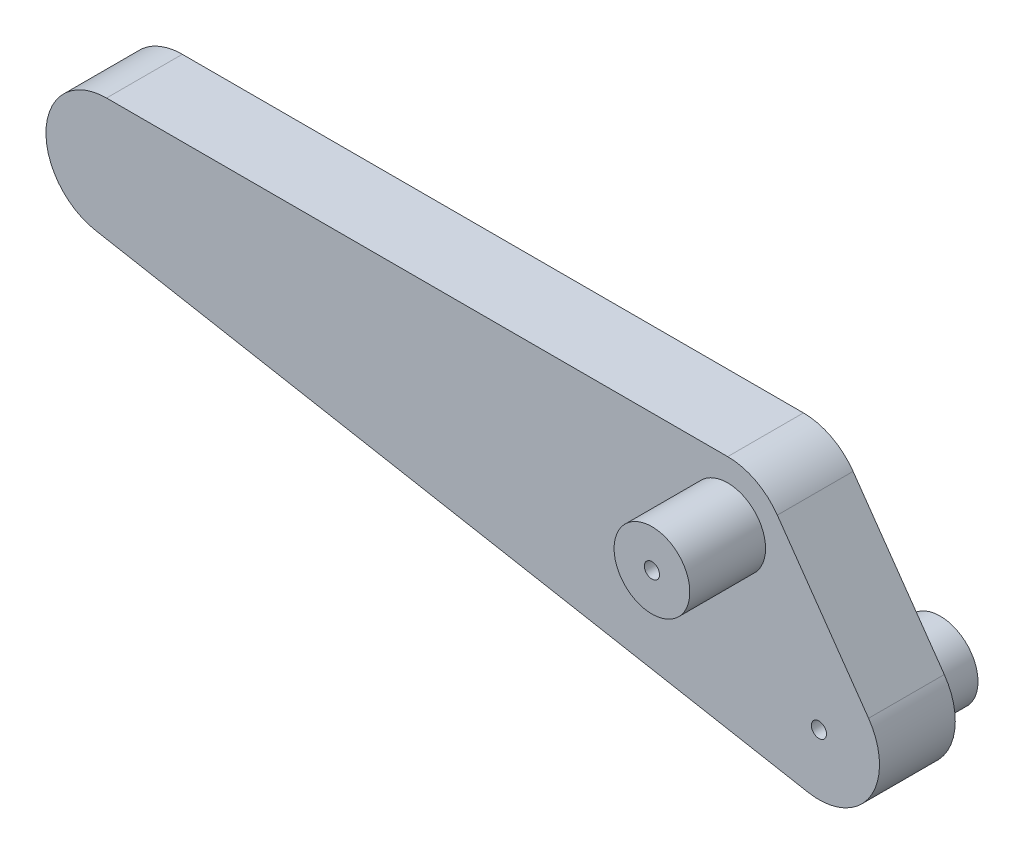
ISO-10303-21;
HEADER;
FILE_DESCRIPTION(('STEP AP214'),'2;1');
FILE_NAME('part.step','',(''),(''),'','','');
FILE_SCHEMA(('AUTOMOTIVE_DESIGN { 1 0 10303 214 1 1 1 1 }'));
ENDSEC;
DATA;
#1=APPLICATION_CONTEXT('core data for automotive mechanical design processes');
#2=APPLICATION_PROTOCOL_DEFINITION('international standard','automotive_design',2000,#1);
#3=PRODUCT_CONTEXT('',#1,'mechanical');
#4=PRODUCT('Part','Part','',(#3));
#5=PRODUCT_RELATED_PRODUCT_CATEGORY('part','',(#4));
#6=PRODUCT_DEFINITION_FORMATION('','',#4);
#7=PRODUCT_DEFINITION_CONTEXT('part definition',#1,'design');
#8=PRODUCT_DEFINITION('design','',#6,#7);
#9=PRODUCT_DEFINITION_SHAPE('','',#8);
#10=(LENGTH_UNIT() NAMED_UNIT(*) SI_UNIT(.MILLI.,.METRE.));
#11=(NAMED_UNIT(*) PLANE_ANGLE_UNIT() SI_UNIT($,.RADIAN.));
#12=(NAMED_UNIT(*) SI_UNIT($,.STERADIAN.) SOLID_ANGLE_UNIT());
#13=UNCERTAINTY_MEASURE_WITH_UNIT(LENGTH_MEASURE(1.E-05),#10,'distance_accuracy_value','');
#14=(GEOMETRIC_REPRESENTATION_CONTEXT(3) GLOBAL_UNCERTAINTY_ASSIGNED_CONTEXT((#13)) GLOBAL_UNIT_ASSIGNED_CONTEXT((#10,
#11,#12)) REPRESENTATION_CONTEXT('',''));
#15=CARTESIAN_POINT('',(0.,0.,0.));
#16=DIRECTION('',(0.,0.,1.));
#17=DIRECTION('',(1.,0.,0.));
#18=AXIS2_PLACEMENT_3D('',#15,#16,#17);
#19=CARTESIAN_POINT('',(0.,0.,5.));
#20=DIRECTION('',(0.,0.,1.));
#21=DIRECTION('',(1.,0.,0.));
#22=AXIS2_PLACEMENT_3D('',#19,#20,#21);
#23=PLANE('',#22);
#24=CARTESIAN_POINT('',(0.,0.,5.));
#25=DIRECTION('',(0.,0.,1.));
#26=DIRECTION('',(1.,0.,0.));
#27=AXIS2_PLACEMENT_3D('',#24,#25,#26);
#28=CIRCLE('',#27,2.5);
#29=CARTESIAN_POINT('',(2.5,0.,5.));
#30=VERTEX_POINT('',#29);
#31=EDGE_CURVE('E123',#30,#30,#28,.T.);
#32=ORIENTED_EDGE('',*,*,#31,.F.);
#33=EDGE_LOOP('',(#32));
#34=FACE_BOUND('',#33,.T.);
#35=CARTESIAN_POINT('',(0.,0.,5.));
#36=DIRECTION('',(0.,0.,1.));
#37=DIRECTION('',(1.,0.,0.));
#38=AXIS2_PLACEMENT_3D('',#35,#36,#37);
#39=CIRCLE('',#38,4.);
#40=CARTESIAN_POINT('',(3.27660817715596,2.2943057454042,5.));
#41=VERTEX_POINT('',#40);
#42=CARTESIAN_POINT('',(0.,4.,5.));
#43=VERTEX_POINT('',#42);
#44=EDGE_CURVE('E130',#41,#43,#39,.T.);
#45=ORIENTED_EDGE('',*,*,#44,.T.);
#46=DIRECTION('',(-1.,0.,0.));
#47=VECTOR('',#46,1.);
#48=CARTESIAN_POINT('',(-41.,3.99999999999999,5.));
#49=LINE('',#48,#47);
#50=CARTESIAN_POINT('',(-41.,3.99999999999999,5.));
#51=VERTEX_POINT('',#50);
#52=EDGE_CURVE('E88',#43,#51,#49,.T.);
#53=ORIENTED_EDGE('',*,*,#52,.T.);
#54=CARTESIAN_POINT('',(-41.,0.,5.));
#55=DIRECTION('',(0.,0.,1.));
#56=DIRECTION('',(1.,0.,0.));
#57=AXIS2_PLACEMENT_3D('',#54,#55,#56);
#58=CIRCLE('',#57,4.);
#59=CARTESIAN_POINT('',(-41.7197161864064,-3.9347183648928,5.));
#60=VERTEX_POINT('',#59);
#61=EDGE_CURVE('E101',#51,#60,#58,.T.);
#62=ORIENTED_EDGE('',*,*,#61,.T.);
#63=DIRECTION('',(0.983679591223199,-0.179929046601599,0.));
#64=VECTOR('',#63,1.);
#65=CARTESIAN_POINT('',(5.30283639527963,-12.5358148299272,5.));
#66=LINE('',#65,#64);
#67=CARTESIAN_POINT('',(5.30283639527963,-12.5358148299272,5.));
#68=VERTEX_POINT('',#67);
#69=EDGE_CURVE('E95',#60,#68,#66,.T.);
#70=ORIENTED_EDGE('',*,*,#69,.T.);
#71=CARTESIAN_POINT('',(6.02255258168603,-8.60109646503438,5.));
#72=DIRECTION('',(0.,0.,1.));
#73=DIRECTION('',(1.,0.,0.));
#74=AXIS2_PLACEMENT_3D('',#71,#72,#73);
#75=CIRCLE('',#74,4.);
#76=CARTESIAN_POINT('',(9.29916075884199,-6.30679071963019,5.));
#77=VERTEX_POINT('',#76);
#78=EDGE_CURVE('E99',#68,#77,#75,.T.);
#79=ORIENTED_EDGE('',*,*,#78,.T.);
#80=DIRECTION('',(-0.57357643635105,0.819152044288989,0.));
#81=VECTOR('',#80,1.);
#82=CARTESIAN_POINT('',(3.27660817715596,2.2943057454042,5.));
#83=LINE('',#82,#81);
#84=EDGE_CURVE('E51',#77,#41,#83,.T.);
#85=ORIENTED_EDGE('',*,*,#84,.T.);
#86=EDGE_LOOP('',(#45,#53,#62,#70,#79,#85));
#87=FACE_BOUND('',#86,.T.);
#88=CARTESIAN_POINT('',(6.02255258168603,-8.60109646503438,5.));
#89=DIRECTION('',(0.,0.,1.));
#90=DIRECTION('',(1.,0.,0.));
#91=AXIS2_PLACEMENT_3D('',#88,#89,#90);
#92=CIRCLE('',#91,0.500000000000001);
#93=CARTESIAN_POINT('',(6.52255258168603,-8.60109646503438,5.));
#94=VERTEX_POINT('',#93);
#95=EDGE_CURVE('E199',#94,#94,#92,.T.);
#96=ORIENTED_EDGE('',*,*,#95,.F.);
#97=EDGE_LOOP('',(#96));
#98=FACE_BOUND('',#97,.T.);
#99=ADVANCED_FACE('F34',(#34,#87,#98),#23,.T.);
#100=CARTESIAN_POINT('',(0.,0.,0.));
#101=DIRECTION('',(0.,0.,1.));
#102=DIRECTION('',(1.,0.,0.));
#103=AXIS2_PLACEMENT_3D('',#100,#101,#102);
#104=PLANE('',#103);
#105=CARTESIAN_POINT('',(0.,0.,0.));
#106=DIRECTION('',(0.,0.,1.));
#107=DIRECTION('',(1.,0.,0.));
#108=AXIS2_PLACEMENT_3D('',#105,#106,#107);
#109=CIRCLE('',#108,4.);
#110=CARTESIAN_POINT('',(3.27660817715596,2.2943057454042,0.));
#111=VERTEX_POINT('',#110);
#112=CARTESIAN_POINT('',(0.,4.,0.));
#113=VERTEX_POINT('',#112);
#114=EDGE_CURVE('E119',#111,#113,#109,.T.);
#115=ORIENTED_EDGE('',*,*,#114,.F.);
#116=DIRECTION('',(-0.57357643635105,0.819152044288989,0.));
#117=VECTOR('',#116,1.);
#118=CARTESIAN_POINT('',(3.27660817715596,2.2943057454042,0.));
#119=LINE('',#118,#117);
#120=CARTESIAN_POINT('',(9.29916075884199,-6.30679071963019,0.));
#121=VERTEX_POINT('',#120);
#122=EDGE_CURVE('E80',#121,#111,#119,.T.);
#123=ORIENTED_EDGE('',*,*,#122,.F.);
#124=CARTESIAN_POINT('',(6.02255258168603,-8.60109646503438,0.));
#125=DIRECTION('',(0.,0.,1.));
#126=DIRECTION('',(1.,0.,0.));
#127=AXIS2_PLACEMENT_3D('',#124,#125,#126);
#128=CIRCLE('',#127,4.);
#129=CARTESIAN_POINT('',(5.30283639527963,-12.5358148299272,0.));
#130=VERTEX_POINT('',#129);
#131=EDGE_CURVE('E74',#130,#121,#128,.T.);
#132=ORIENTED_EDGE('',*,*,#131,.F.);
#133=DIRECTION('',(0.983679591223199,-0.179929046601599,0.));
#134=VECTOR('',#133,1.);
#135=CARTESIAN_POINT('',(5.30283639527963,-12.5358148299272,0.));
#136=LINE('',#135,#134);
#137=CARTESIAN_POINT('',(-41.7197161864064,-3.9347183648928,0.));
#138=VERTEX_POINT('',#137);
#139=EDGE_CURVE('E109',#138,#130,#136,.T.);
#140=ORIENTED_EDGE('',*,*,#139,.F.);
#141=CARTESIAN_POINT('',(-41.,0.,0.));
#142=DIRECTION('',(0.,0.,1.));
#143=DIRECTION('',(1.,0.,0.));
#144=AXIS2_PLACEMENT_3D('',#141,#142,#143);
#145=CIRCLE('',#144,4.);
#146=CARTESIAN_POINT('',(-41.,3.99999999999999,0.));
#147=VERTEX_POINT('',#146);
#148=EDGE_CURVE('E125',#147,#138,#145,.T.);
#149=ORIENTED_EDGE('',*,*,#148,.F.);
#150=DIRECTION('',(-1.,0.,0.));
#151=VECTOR('',#150,1.);
#152=CARTESIAN_POINT('',(-41.,3.99999999999999,0.));
#153=LINE('',#152,#151);
#154=EDGE_CURVE('E122',#113,#147,#153,.T.);
#155=ORIENTED_EDGE('',*,*,#154,.F.);
#156=EDGE_LOOP('',(#115,#123,#132,#140,#149,#155));
#157=FACE_BOUND('',#156,.T.);
#158=CARTESIAN_POINT('',(6.02255258168603,-8.60109646503438,0.));
#159=DIRECTION('',(0.,0.,1.));
#160=DIRECTION('',(1.,0.,0.));
#161=AXIS2_PLACEMENT_3D('',#158,#159,#160);
#162=CIRCLE('',#161,2.5);
#163=CARTESIAN_POINT('',(8.52255258168603,-8.60109646503438,0.));
#164=VERTEX_POINT('',#163);
#165=EDGE_CURVE('E208',#164,#164,#162,.T.);
#166=ORIENTED_EDGE('',*,*,#165,.T.);
#167=EDGE_LOOP('',(#166));
#168=FACE_BOUND('',#167,.T.);
#169=CARTESIAN_POINT('',(0.,0.,0.));
#170=DIRECTION('',(0.,0.,-1.));
#171=DIRECTION('',(-1.,0.,0.));
#172=AXIS2_PLACEMENT_3D('',#169,#170,#171);
#173=CIRCLE('',#172,0.5);
#174=CARTESIAN_POINT('',(-0.5,0.,0.));
#175=VERTEX_POINT('',#174);
#176=EDGE_CURVE('E191',#175,#175,#173,.T.);
#177=ORIENTED_EDGE('',*,*,#176,.F.);
#178=EDGE_LOOP('',(#177));
#179=FACE_BOUND('',#178,.T.);
#180=ADVANCED_FACE('F139',(#157,#168,#179),#104,.F.);
#181=CARTESIAN_POINT('',(0.,0.,5.));
#182=DIRECTION('',(0.,0.,-1.));
#183=DIRECTION('',(-1.,0.,0.));
#184=AXIS2_PLACEMENT_3D('',#181,#182,#183);
#185=CYLINDRICAL_SURFACE('',#184,4.);
#186=ORIENTED_EDGE('',*,*,#114,.T.);
#187=DIRECTION('',(0.,0.,-1.));
#188=VECTOR('',#187,1.);
#189=CARTESIAN_POINT('',(0.,4.,5.));
#190=LINE('',#189,#188);
#191=EDGE_CURVE('E11',#43,#113,#190,.T.);
#192=ORIENTED_EDGE('',*,*,#191,.F.);
#193=ORIENTED_EDGE('',*,*,#44,.F.);
#194=DIRECTION('',(0.,0.,-1.));
#195=VECTOR('',#194,1.);
#196=CARTESIAN_POINT('',(3.27660817715596,2.2943057454042,5.));
#197=LINE('',#196,#195);
#198=EDGE_CURVE('E115',#41,#111,#197,.T.);
#199=ORIENTED_EDGE('',*,*,#198,.T.);
#200=EDGE_LOOP('',(#186,#192,#193,#199));
#201=FACE_BOUND('',#200,.T.);
#202=ADVANCED_FACE('F36',(#201),#185,.T.);
#203=CARTESIAN_POINT('',(-41.,3.99999999999999,5.));
#204=DIRECTION('',(0.,-1.,0.));
#205=DIRECTION('',(1.,0.,0.));
#206=AXIS2_PLACEMENT_3D('',#203,#204,#205);
#207=PLANE('',#206);
#208=ORIENTED_EDGE('',*,*,#154,.T.);
#209=DIRECTION('',(0.,0.,-1.));
#210=VECTOR('',#209,1.);
#211=CARTESIAN_POINT('',(-41.,3.99999999999999,5.));
#212=LINE('',#211,#210);
#213=EDGE_CURVE('E43',#51,#147,#212,.T.);
#214=ORIENTED_EDGE('',*,*,#213,.F.);
#215=ORIENTED_EDGE('',*,*,#52,.F.);
#216=ORIENTED_EDGE('',*,*,#191,.T.);
#217=EDGE_LOOP('',(#208,#214,#215,#216));
#218=FACE_BOUND('',#217,.T.);
#219=ADVANCED_FACE('F277',(#218),#207,.F.);
#220=CARTESIAN_POINT('',(-41.,0.,5.));
#221=DIRECTION('',(0.,0.,-1.));
#222=DIRECTION('',(-1.,0.,0.));
#223=AXIS2_PLACEMENT_3D('',#220,#221,#222);
#224=CYLINDRICAL_SURFACE('',#223,4.);
#225=ORIENTED_EDGE('',*,*,#148,.T.);
#226=DIRECTION('',(0.,0.,-1.));
#227=VECTOR('',#226,1.);
#228=CARTESIAN_POINT('',(-41.7197161864064,-3.9347183648928,5.));
#229=LINE('',#228,#227);
#230=EDGE_CURVE('E110',#60,#138,#229,.T.);
#231=ORIENTED_EDGE('',*,*,#230,.F.);
#232=ORIENTED_EDGE('',*,*,#61,.F.);
#233=ORIENTED_EDGE('',*,*,#213,.T.);
#234=EDGE_LOOP('',(#225,#231,#232,#233));
#235=FACE_BOUND('',#234,.T.);
#236=ADVANCED_FACE('F136',(#235),#224,.T.);
#237=CARTESIAN_POINT('',(5.30283639527963,-12.5358148299272,5.));
#238=DIRECTION('',(0.179929046601599,0.983679591223199,0.));
#239=DIRECTION('',(-0.983679591223199,0.179929046601599,0.));
#240=AXIS2_PLACEMENT_3D('',#237,#238,#239);
#241=PLANE('',#240);
#242=ORIENTED_EDGE('',*,*,#139,.T.);
#243=DIRECTION('',(0.,0.,-1.));
#244=VECTOR('',#243,1.);
#245=CARTESIAN_POINT('',(5.30283639527963,-12.5358148299272,5.));
#246=LINE('',#245,#244);
#247=EDGE_CURVE('E106',#68,#130,#246,.T.);
#248=ORIENTED_EDGE('',*,*,#247,.F.);
#249=ORIENTED_EDGE('',*,*,#69,.F.);
#250=ORIENTED_EDGE('',*,*,#230,.T.);
#251=EDGE_LOOP('',(#242,#248,#249,#250));
#252=FACE_BOUND('',#251,.T.);
#253=ADVANCED_FACE('F107',(#252),#241,.F.);
#254=CARTESIAN_POINT('',(6.02255258168603,-8.60109646503438,5.));
#255=DIRECTION('',(0.,0.,-1.));
#256=DIRECTION('',(-1.,0.,0.));
#257=AXIS2_PLACEMENT_3D('',#254,#255,#256);
#258=CYLINDRICAL_SURFACE('',#257,4.);
#259=ORIENTED_EDGE('',*,*,#131,.T.);
#260=DIRECTION('',(0.,0.,-1.));
#261=VECTOR('',#260,1.);
#262=CARTESIAN_POINT('',(9.29916075884199,-6.30679071963019,5.));
#263=LINE('',#262,#261);
#264=EDGE_CURVE('E111',#77,#121,#263,.T.);
#265=ORIENTED_EDGE('',*,*,#264,.F.);
#266=ORIENTED_EDGE('',*,*,#78,.F.);
#267=ORIENTED_EDGE('',*,*,#247,.T.);
#268=EDGE_LOOP('',(#259,#265,#266,#267));
#269=FACE_BOUND('',#268,.T.);
#270=ADVANCED_FACE('F113',(#269),#258,.T.);
#271=CARTESIAN_POINT('',(3.27660817715596,2.2943057454042,5.));
#272=DIRECTION('',(-0.819152044288989,-0.57357643635105,0.));
#273=DIRECTION('',(0.57357643635105,-0.819152044288989,0.));
#274=AXIS2_PLACEMENT_3D('',#271,#272,#273);
#275=PLANE('',#274);
#276=ORIENTED_EDGE('',*,*,#122,.T.);
#277=ORIENTED_EDGE('',*,*,#198,.F.);
#278=ORIENTED_EDGE('',*,*,#84,.F.);
#279=ORIENTED_EDGE('',*,*,#264,.T.);
#280=EDGE_LOOP('',(#276,#277,#278,#279));
#281=FACE_BOUND('',#280,.T.);
#282=ADVANCED_FACE('F144',(#281),#275,.F.);
#283=CARTESIAN_POINT('',(6.02255258168603,-8.60109646503438,-3.));
#284=DIRECTION('',(0.,0.,1.));
#285=DIRECTION('',(1.,0.,0.));
#286=AXIS2_PLACEMENT_3D('',#283,#284,#285);
#287=CYLINDRICAL_SURFACE('',#286,2.5);
#288=CARTESIAN_POINT('',(6.02255258168603,-8.60109646503438,-3.));
#289=DIRECTION('',(0.,0.,1.));
#290=DIRECTION('',(1.,0.,0.));
#291=AXIS2_PLACEMENT_3D('',#288,#289,#290);
#292=CIRCLE('',#291,2.5);
#293=CARTESIAN_POINT('',(8.52255258168603,-8.60109646503438,-3.));
#294=VERTEX_POINT('',#293);
#295=EDGE_CURVE('E203',#294,#294,#292,.T.);
#296=ORIENTED_EDGE('',*,*,#295,.T.);
#297=EDGE_LOOP('',(#296));
#298=FACE_BOUND('',#297,.T.);
#299=ORIENTED_EDGE('',*,*,#165,.F.);
#300=EDGE_LOOP('',(#299));
#301=FACE_BOUND('',#300,.T.);
#302=ADVANCED_FACE('F146',(#298,#301),#287,.T.);
#303=CARTESIAN_POINT('',(6.02255258168603,-8.60109646503438,-3.));
#304=DIRECTION('',(0.,0.,1.));
#305=DIRECTION('',(1.,0.,0.));
#306=AXIS2_PLACEMENT_3D('',#303,#304,#305);
#307=PLANE('',#306);
#308=CARTESIAN_POINT('',(6.02255258168603,-8.60109646503438,-3.));
#309=DIRECTION('',(0.,0.,1.));
#310=DIRECTION('',(1.,0.,0.));
#311=AXIS2_PLACEMENT_3D('',#308,#309,#310);
#312=CIRCLE('',#311,0.500000000000001);
#313=CARTESIAN_POINT('',(6.52255258168603,-8.60109646503438,-3.));
#314=VERTEX_POINT('',#313);
#315=EDGE_CURVE('E200',#314,#314,#312,.T.);
#316=ORIENTED_EDGE('',*,*,#315,.T.);
#317=EDGE_LOOP('',(#316));
#318=FACE_BOUND('',#317,.T.);
#319=ORIENTED_EDGE('',*,*,#295,.F.);
#320=EDGE_LOOP('',(#319));
#321=FACE_BOUND('',#320,.T.);
#322=ADVANCED_FACE('F152',(#318,#321),#307,.F.);
#323=CARTESIAN_POINT('',(6.02255258168603,-8.60109646503438,-3.));
#324=DIRECTION('',(0.,0.,1.));
#325=DIRECTION('',(1.,0.,0.));
#326=AXIS2_PLACEMENT_3D('',#323,#324,#325);
#327=CYLINDRICAL_SURFACE('',#326,0.500000000000001);
#328=ORIENTED_EDGE('',*,*,#315,.F.);
#329=EDGE_LOOP('',(#328));
#330=FACE_BOUND('',#329,.T.);
#331=ORIENTED_EDGE('',*,*,#95,.T.);
#332=EDGE_LOOP('',(#331));
#333=FACE_BOUND('',#332,.T.);
#334=ADVANCED_FACE('F167',(#330,#333),#327,.F.);
#335=CARTESIAN_POINT('',(0.,0.,10.));
#336=DIRECTION('',(0.,0.,-1.));
#337=DIRECTION('',(-1.,0.,0.));
#338=AXIS2_PLACEMENT_3D('',#335,#336,#337);
#339=CYLINDRICAL_SURFACE('',#338,2.5);
#340=ORIENTED_EDGE('',*,*,#31,.T.);
#341=EDGE_LOOP('',(#340));
#342=FACE_BOUND('',#341,.T.);
#343=CARTESIAN_POINT('',(0.,0.,10.));
#344=DIRECTION('',(0.,0.,-1.));
#345=DIRECTION('',(-1.,0.,0.));
#346=AXIS2_PLACEMENT_3D('',#343,#344,#345);
#347=CIRCLE('',#346,2.5);
#348=CARTESIAN_POINT('',(-2.5,0.,10.));
#349=VERTEX_POINT('',#348);
#350=EDGE_CURVE('E194',#349,#349,#347,.T.);
#351=ORIENTED_EDGE('',*,*,#350,.T.);
#352=EDGE_LOOP('',(#351));
#353=FACE_BOUND('',#352,.T.);
#354=ADVANCED_FACE('F171',(#342,#353),#339,.T.);
#355=CARTESIAN_POINT('',(0.,0.,10.));
#356=DIRECTION('',(0.,0.,-1.));
#357=DIRECTION('',(-1.,0.,0.));
#358=AXIS2_PLACEMENT_3D('',#355,#356,#357);
#359=PLANE('',#358);
#360=CARTESIAN_POINT('',(0.,0.,10.));
#361=DIRECTION('',(0.,0.,-1.));
#362=DIRECTION('',(-1.,0.,0.));
#363=AXIS2_PLACEMENT_3D('',#360,#361,#362);
#364=CIRCLE('',#363,0.5);
#365=CARTESIAN_POINT('',(-0.5,0.,10.));
#366=VERTEX_POINT('',#365);
#367=EDGE_CURVE('E188',#366,#366,#364,.T.);
#368=ORIENTED_EDGE('',*,*,#367,.T.);
#369=EDGE_LOOP('',(#368));
#370=FACE_BOUND('',#369,.T.);
#371=ORIENTED_EDGE('',*,*,#350,.F.);
#372=EDGE_LOOP('',(#371));
#373=FACE_BOUND('',#372,.T.);
#374=ADVANCED_FACE('F175',(#370,#373),#359,.F.);
#375=CARTESIAN_POINT('',(0.,0.,10.));
#376=DIRECTION('',(0.,0.,-1.));
#377=DIRECTION('',(-1.,0.,0.));
#378=AXIS2_PLACEMENT_3D('',#375,#376,#377);
#379=CYLINDRICAL_SURFACE('',#378,0.5);
#380=ORIENTED_EDGE('',*,*,#367,.F.);
#381=EDGE_LOOP('',(#380));
#382=FACE_BOUND('',#381,.T.);
#383=ORIENTED_EDGE('',*,*,#176,.T.);
#384=EDGE_LOOP('',(#383));
#385=FACE_BOUND('',#384,.T.);
#386=ADVANCED_FACE('F179',(#382,#385),#379,.F.);
#387=CLOSED_SHELL('',(#99,#180,#202,#219,#236,#253,#270,#282,#302,#322,#334,#354,#374,#386));
#388=MANIFOLD_SOLID_BREP('B2',#387);
#389=ADVANCED_BREP_SHAPE_REPRESENTATION('',(#18,#388),#14);
#390=SHAPE_DEFINITION_REPRESENTATION(#9,#389);
ENDSEC;
END-ISO-10303-21;
